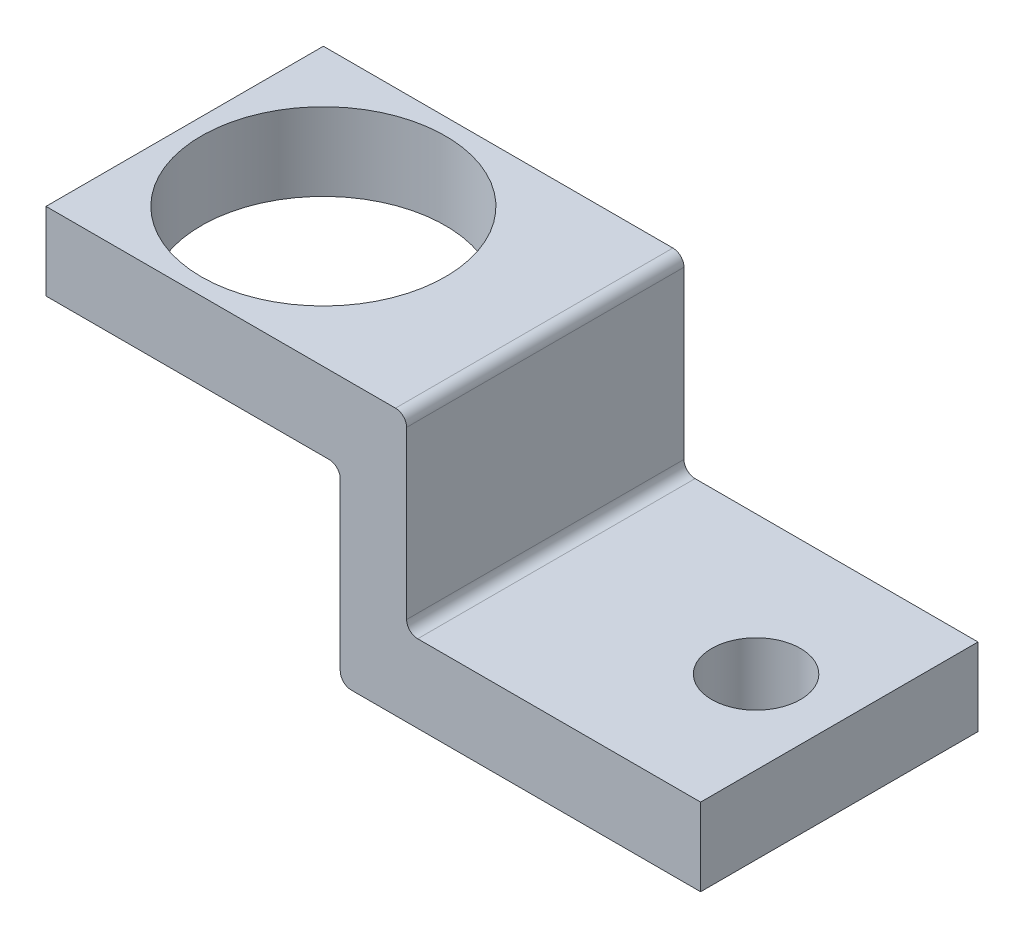
ISO-10303-21;
HEADER;
FILE_DESCRIPTION(('STEP AP214'),'2;1');
FILE_NAME('part.step','',(''),(''),'','','');
FILE_SCHEMA(('AUTOMOTIVE_DESIGN { 1 0 10303 214 1 1 1 1 }'));
ENDSEC;
DATA;
#1=APPLICATION_CONTEXT('core data for automotive mechanical design processes');
#2=APPLICATION_PROTOCOL_DEFINITION('international standard','automotive_design',2000,#1);
#3=PRODUCT_CONTEXT('',#1,'mechanical');
#4=PRODUCT('Part','Part','',(#3));
#5=PRODUCT_RELATED_PRODUCT_CATEGORY('part','',(#4));
#6=PRODUCT_DEFINITION_FORMATION('','',#4);
#7=PRODUCT_DEFINITION_CONTEXT('part definition',#1,'design');
#8=PRODUCT_DEFINITION('design','',#6,#7);
#9=PRODUCT_DEFINITION_SHAPE('','',#8);
#10=(LENGTH_UNIT() NAMED_UNIT(*) SI_UNIT(.MILLI.,.METRE.));
#11=(NAMED_UNIT(*) PLANE_ANGLE_UNIT() SI_UNIT($,.RADIAN.));
#12=(NAMED_UNIT(*) SI_UNIT($,.STERADIAN.) SOLID_ANGLE_UNIT());
#13=UNCERTAINTY_MEASURE_WITH_UNIT(LENGTH_MEASURE(1.E-05),#10,'distance_accuracy_value','');
#14=(GEOMETRIC_REPRESENTATION_CONTEXT(3) GLOBAL_UNCERTAINTY_ASSIGNED_CONTEXT((#13)) GLOBAL_UNIT_ASSIGNED_CONTEXT((#10,
#11,#12)) REPRESENTATION_CONTEXT('',''));
#15=CARTESIAN_POINT('',(0.,0.,0.));
#16=DIRECTION('',(0.,0.,1.));
#17=DIRECTION('',(1.,0.,0.));
#18=AXIS2_PLACEMENT_3D('',#15,#16,#17);
#19=CARTESIAN_POINT('',(25.5200845665962,0.,25.));
#20=DIRECTION('',(0.,1.,0.));
#21=DIRECTION('',(0.,0.,1.));
#22=AXIS2_PLACEMENT_3D('',#19,#20,#21);
#23=PLANE('',#22);
#24=CARTESIAN_POINT('',(12.5,0.,12.5));
#25=DIRECTION('',(0.,1.,0.));
#26=DIRECTION('',(0.,0.,1.));
#27=AXIS2_PLACEMENT_3D('',#24,#25,#26);
#28=CIRCLE('',#27,11.);
#29=CARTESIAN_POINT('',(12.5,0.,23.5));
#30=VERTEX_POINT('',#29);
#31=EDGE_CURVE('E173',#30,#30,#28,.T.);
#32=ORIENTED_EDGE('',*,*,#31,.T.);
#33=EDGE_LOOP('',(#32));
#34=FACE_BOUND('',#33,.T.);
#35=DIRECTION('',(1.,0.,0.));
#36=VECTOR('',#35,1.);
#37=CARTESIAN_POINT('',(25.5200845665962,0.,0.));
#38=LINE('',#37,#36);
#39=CARTESIAN_POINT('',(0.,0.,0.));
#40=VERTEX_POINT('',#39);
#41=CARTESIAN_POINT('',(25.5200845665962,0.,0.));
#42=VERTEX_POINT('',#41);
#43=EDGE_CURVE('E168',#40,#42,#38,.T.);
#44=ORIENTED_EDGE('',*,*,#43,.T.);
#45=DIRECTION('',(0.,0.,-1.));
#46=VECTOR('',#45,1.);
#47=CARTESIAN_POINT('',(25.5200845665962,0.,25.));
#48=LINE('',#47,#46);
#49=CARTESIAN_POINT('',(25.5200845665962,0.,25.));
#50=VERTEX_POINT('',#49);
#51=EDGE_CURVE('E11',#50,#42,#48,.T.);
#52=ORIENTED_EDGE('',*,*,#51,.F.);
#53=DIRECTION('',(1.,0.,0.));
#54=VECTOR('',#53,1.);
#55=CARTESIAN_POINT('',(25.5200845665962,0.,25.));
#56=LINE('',#55,#54);
#57=CARTESIAN_POINT('',(0.,0.,25.));
#58=VERTEX_POINT('',#57);
#59=EDGE_CURVE('E203',#58,#50,#56,.T.);
#60=ORIENTED_EDGE('',*,*,#59,.F.);
#61=DIRECTION('',(0.,0.,-1.));
#62=VECTOR('',#61,1.);
#63=CARTESIAN_POINT('',(0.,0.,25.));
#64=LINE('',#63,#62);
#65=EDGE_CURVE('E164',#58,#40,#64,.T.);
#66=ORIENTED_EDGE('',*,*,#65,.T.);
#67=EDGE_LOOP('',(#44,#52,#60,#66));
#68=FACE_BOUND('',#67,.T.);
#69=ADVANCED_FACE('F43',(#34,#68),#23,.F.);
#70=CARTESIAN_POINT('',(25.5200845665962,-1.,25.));
#71=DIRECTION('',(0.,0.,-1.));
#72=DIRECTION('',(-1.,0.,0.));
#73=AXIS2_PLACEMENT_3D('',#70,#71,#72);
#74=CYLINDRICAL_SURFACE('',#73,1.);
#75=CARTESIAN_POINT('',(25.5200845665962,-1.,0.));
#76=DIRECTION('',(0.,0.,-1.));
#77=DIRECTION('',(1.,0.,0.));
#78=AXIS2_PLACEMENT_3D('',#75,#76,#77);
#79=CIRCLE('',#78,1.);
#80=CARTESIAN_POINT('',(26.5200845665962,-1.00000000000001,0.));
#81=VERTEX_POINT('',#80);
#82=EDGE_CURVE('E172',#42,#81,#79,.T.);
#83=ORIENTED_EDGE('',*,*,#82,.T.);
#84=DIRECTION('',(0.,0.,-1.));
#85=VECTOR('',#84,1.);
#86=CARTESIAN_POINT('',(26.5200845665962,-1.00000000000001,25.));
#87=LINE('',#86,#85);
#88=CARTESIAN_POINT('',(26.5200845665962,-1.00000000000001,25.));
#89=VERTEX_POINT('',#88);
#90=EDGE_CURVE('E52',#89,#81,#87,.T.);
#91=ORIENTED_EDGE('',*,*,#90,.F.);
#92=CARTESIAN_POINT('',(25.5200845665962,-1.,25.));
#93=DIRECTION('',(0.,0.,-1.));
#94=DIRECTION('',(1.,0.,0.));
#95=AXIS2_PLACEMENT_3D('',#92,#93,#94);
#96=CIRCLE('',#95,1.);
#97=EDGE_CURVE('E115',#50,#89,#96,.T.);
#98=ORIENTED_EDGE('',*,*,#97,.F.);
#99=ORIENTED_EDGE('',*,*,#51,.T.);
#100=EDGE_LOOP('',(#83,#91,#98,#99));
#101=FACE_BOUND('',#100,.T.);
#102=ADVANCED_FACE('F298',(#101),#74,.F.);
#103=CARTESIAN_POINT('',(26.5200845665962,-16.,25.));
#104=DIRECTION('',(1.,0.,0.));
#105=DIRECTION('',(0.,0.,-1.));
#106=AXIS2_PLACEMENT_3D('',#103,#104,#105);
#107=PLANE('',#106);
#108=DIRECTION('',(0.,-1.,0.));
#109=VECTOR('',#108,1.);
#110=CARTESIAN_POINT('',(26.5200845665962,-16.,0.));
#111=LINE('',#110,#109);
#112=CARTESIAN_POINT('',(26.5200845665962,-16.,0.));
#113=VERTEX_POINT('',#112);
#114=EDGE_CURVE('E176',#81,#113,#111,.T.);
#115=ORIENTED_EDGE('',*,*,#114,.T.);
#116=DIRECTION('',(0.,0.,-1.));
#117=VECTOR('',#116,1.);
#118=CARTESIAN_POINT('',(26.5200845665962,-16.,25.));
#119=LINE('',#118,#117);
#120=CARTESIAN_POINT('',(26.5200845665962,-16.,25.));
#121=VERTEX_POINT('',#120);
#122=EDGE_CURVE('E230',#121,#113,#119,.T.);
#123=ORIENTED_EDGE('',*,*,#122,.F.);
#124=DIRECTION('',(0.,-1.,0.));
#125=VECTOR('',#124,1.);
#126=CARTESIAN_POINT('',(26.5200845665962,-16.,25.));
#127=LINE('',#126,#125);
#128=EDGE_CURVE('E240',#89,#121,#127,.T.);
#129=ORIENTED_EDGE('',*,*,#128,.F.);
#130=ORIENTED_EDGE('',*,*,#90,.T.);
#131=EDGE_LOOP('',(#115,#123,#129,#130));
#132=FACE_BOUND('',#131,.T.);
#133=ADVANCED_FACE('F238',(#132),#107,.F.);
#134=CARTESIAN_POINT('',(27.5200845665962,-16.,25.));
#135=DIRECTION('',(0.,0.,-1.));
#136=DIRECTION('',(-1.,0.,0.));
#137=AXIS2_PLACEMENT_3D('',#134,#135,#136);
#138=CYLINDRICAL_SURFACE('',#137,1.);
#139=CARTESIAN_POINT('',(27.5200845665962,-16.,0.));
#140=DIRECTION('',(0.,0.,1.));
#141=DIRECTION('',(-1.,0.,0.));
#142=AXIS2_PLACEMENT_3D('',#139,#140,#141);
#143=CIRCLE('',#142,1.);
#144=CARTESIAN_POINT('',(27.5200845665962,-17.,0.));
#145=VERTEX_POINT('',#144);
#146=EDGE_CURVE('E179',#113,#145,#143,.T.);
#147=ORIENTED_EDGE('',*,*,#146,.T.);
#148=DIRECTION('',(0.,0.,-1.));
#149=VECTOR('',#148,1.);
#150=CARTESIAN_POINT('',(27.5200845665962,-17.,25.));
#151=LINE('',#150,#149);
#152=CARTESIAN_POINT('',(27.5200845665962,-17.,25.));
#153=VERTEX_POINT('',#152);
#154=EDGE_CURVE('E226',#153,#145,#151,.T.);
#155=ORIENTED_EDGE('',*,*,#154,.F.);
#156=CARTESIAN_POINT('',(27.5200845665962,-16.,25.));
#157=DIRECTION('',(0.,0.,1.));
#158=DIRECTION('',(-1.,0.,0.));
#159=AXIS2_PLACEMENT_3D('',#156,#157,#158);
#160=CIRCLE('',#159,1.);
#161=EDGE_CURVE('E259',#121,#153,#160,.T.);
#162=ORIENTED_EDGE('',*,*,#161,.F.);
#163=ORIENTED_EDGE('',*,*,#122,.T.);
#164=EDGE_LOOP('',(#147,#155,#162,#163));
#165=FACE_BOUND('',#164,.T.);
#166=ADVANCED_FACE('F249',(#165),#138,.T.);
#167=CARTESIAN_POINT('',(59.0000845665962,-17.,25.));
#168=DIRECTION('',(0.,1.,0.));
#169=DIRECTION('',(-1.,0.,0.));
#170=AXIS2_PLACEMENT_3D('',#167,#168,#169);
#171=PLANE('',#170);
#172=CARTESIAN_POINT('',(51.5000845665962,-17.,12.5));
#173=DIRECTION('',(0.,1.,0.));
#174=DIRECTION('',(0.,0.,1.));
#175=AXIS2_PLACEMENT_3D('',#172,#173,#174);
#176=CIRCLE('',#175,4.);
#177=CARTESIAN_POINT('',(51.5000845665962,-17.,16.5));
#178=VERTEX_POINT('',#177);
#179=EDGE_CURVE('E311',#178,#178,#176,.T.);
#180=ORIENTED_EDGE('',*,*,#179,.T.);
#181=EDGE_LOOP('',(#180));
#182=FACE_BOUND('',#181,.T.);
#183=DIRECTION('',(1.,0.,0.));
#184=VECTOR('',#183,1.);
#185=CARTESIAN_POINT('',(59.0000845665962,-17.,0.));
#186=LINE('',#185,#184);
#187=CARTESIAN_POINT('',(59.0000845665962,-17.,0.));
#188=VERTEX_POINT('',#187);
#189=EDGE_CURVE('E182',#145,#188,#186,.T.);
#190=ORIENTED_EDGE('',*,*,#189,.T.);
#191=DIRECTION('',(0.,0.,-1.));
#192=VECTOR('',#191,1.);
#193=CARTESIAN_POINT('',(59.0000845665962,-17.,25.));
#194=LINE('',#193,#192);
#195=CARTESIAN_POINT('',(59.0000845665962,-17.,25.));
#196=VERTEX_POINT('',#195);
#197=EDGE_CURVE('E222',#196,#188,#194,.T.);
#198=ORIENTED_EDGE('',*,*,#197,.F.);
#199=DIRECTION('',(1.,0.,0.));
#200=VECTOR('',#199,1.);
#201=CARTESIAN_POINT('',(59.0000845665962,-17.,25.));
#202=LINE('',#201,#200);
#203=EDGE_CURVE('E255',#153,#196,#202,.T.);
#204=ORIENTED_EDGE('',*,*,#203,.F.);
#205=ORIENTED_EDGE('',*,*,#154,.T.);
#206=EDGE_LOOP('',(#190,#198,#204,#205));
#207=FACE_BOUND('',#206,.T.);
#208=ADVANCED_FACE('F253',(#182,#207),#171,.F.);
#209=CARTESIAN_POINT('',(59.0000845665962,-10.,25.));
#210=DIRECTION('',(-1.,0.,0.));
#211=DIRECTION('',(0.,0.,1.));
#212=AXIS2_PLACEMENT_3D('',#209,#210,#211);
#213=PLANE('',#212);
#214=DIRECTION('',(0.,1.,0.));
#215=VECTOR('',#214,1.);
#216=CARTESIAN_POINT('',(59.0000845665962,-10.,0.));
#217=LINE('',#216,#215);
#218=CARTESIAN_POINT('',(59.0000845665962,-10.,0.));
#219=VERTEX_POINT('',#218);
#220=EDGE_CURVE('E185',#188,#219,#217,.T.);
#221=ORIENTED_EDGE('',*,*,#220,.T.);
#222=DIRECTION('',(0.,0.,-1.));
#223=VECTOR('',#222,1.);
#224=CARTESIAN_POINT('',(59.0000845665962,-10.,25.));
#225=LINE('',#224,#223);
#226=CARTESIAN_POINT('',(59.0000845665962,-10.,25.));
#227=VERTEX_POINT('',#226);
#228=EDGE_CURVE('E218',#227,#219,#225,.T.);
#229=ORIENTED_EDGE('',*,*,#228,.F.);
#230=DIRECTION('',(0.,1.,0.));
#231=VECTOR('',#230,1.);
#232=CARTESIAN_POINT('',(59.0000845665962,-10.,25.));
#233=LINE('',#232,#231);
#234=EDGE_CURVE('E258',#196,#227,#233,.T.);
#235=ORIENTED_EDGE('',*,*,#234,.F.);
#236=ORIENTED_EDGE('',*,*,#197,.T.);
#237=EDGE_LOOP('',(#221,#229,#235,#236));
#238=FACE_BOUND('',#237,.T.);
#239=ADVANCED_FACE('F338',(#238),#213,.F.);
#240=CARTESIAN_POINT('',(33.5,-10.,25.));
#241=DIRECTION('',(0.,-1.,0.));
#242=DIRECTION('',(0.,0.,-1.));
#243=AXIS2_PLACEMENT_3D('',#240,#241,#242);
#244=PLANE('',#243);
#245=CARTESIAN_POINT('',(51.5000845665962,-10.,12.5));
#246=DIRECTION('',(0.,1.,0.));
#247=DIRECTION('',(0.,0.,1.));
#248=AXIS2_PLACEMENT_3D('',#245,#246,#247);
#249=CIRCLE('',#248,4.);
#250=CARTESIAN_POINT('',(51.5000845665962,-10.,16.5));
#251=VERTEX_POINT('',#250);
#252=EDGE_CURVE('E319',#251,#251,#249,.T.);
#253=ORIENTED_EDGE('',*,*,#252,.F.);
#254=EDGE_LOOP('',(#253));
#255=FACE_BOUND('',#254,.T.);
#256=DIRECTION('',(-1.,0.,0.));
#257=VECTOR('',#256,1.);
#258=CARTESIAN_POINT('',(33.5,-10.,0.));
#259=LINE('',#258,#257);
#260=CARTESIAN_POINT('',(33.5,-10.,0.));
#261=VERTEX_POINT('',#260);
#262=EDGE_CURVE('E188',#219,#261,#259,.T.);
#263=ORIENTED_EDGE('',*,*,#262,.T.);
#264=DIRECTION('',(0.,0.,-1.));
#265=VECTOR('',#264,1.);
#266=CARTESIAN_POINT('',(33.5,-10.,25.));
#267=LINE('',#266,#265);
#268=CARTESIAN_POINT('',(33.5,-10.,25.));
#269=VERTEX_POINT('',#268);
#270=EDGE_CURVE('E214',#269,#261,#267,.T.);
#271=ORIENTED_EDGE('',*,*,#270,.F.);
#272=DIRECTION('',(-1.,0.,0.));
#273=VECTOR('',#272,1.);
#274=CARTESIAN_POINT('',(33.5,-10.,25.));
#275=LINE('',#274,#273);
#276=EDGE_CURVE('E263',#227,#269,#275,.T.);
#277=ORIENTED_EDGE('',*,*,#276,.F.);
#278=ORIENTED_EDGE('',*,*,#228,.T.);
#279=EDGE_LOOP('',(#263,#271,#277,#278));
#280=FACE_BOUND('',#279,.T.);
#281=ADVANCED_FACE('F335',(#255,#280),#244,.F.);
#282=CARTESIAN_POINT('',(33.5,-9.,25.));
#283=DIRECTION('',(0.,0.,-1.));
#284=DIRECTION('',(-1.,0.,0.));
#285=AXIS2_PLACEMENT_3D('',#282,#283,#284);
#286=CYLINDRICAL_SURFACE('',#285,1.);
#287=CARTESIAN_POINT('',(33.5,-9.,0.));
#288=DIRECTION('',(0.,0.,-1.));
#289=DIRECTION('',(-1.,0.,0.));
#290=AXIS2_PLACEMENT_3D('',#287,#288,#289);
#291=CIRCLE('',#290,1.);
#292=CARTESIAN_POINT('',(32.5,-9.,0.));
#293=VERTEX_POINT('',#292);
#294=EDGE_CURVE('E191',#261,#293,#291,.T.);
#295=ORIENTED_EDGE('',*,*,#294,.T.);
#296=DIRECTION('',(0.,0.,-1.));
#297=VECTOR('',#296,1.);
#298=CARTESIAN_POINT('',(32.5,-9.,25.));
#299=LINE('',#298,#297);
#300=CARTESIAN_POINT('',(32.5,-9.,25.));
#301=VERTEX_POINT('',#300);
#302=EDGE_CURVE('E210',#301,#293,#299,.T.);
#303=ORIENTED_EDGE('',*,*,#302,.F.);
#304=CARTESIAN_POINT('',(33.5,-9.,25.));
#305=DIRECTION('',(0.,0.,-1.));
#306=DIRECTION('',(-1.,0.,0.));
#307=AXIS2_PLACEMENT_3D('',#304,#305,#306);
#308=CIRCLE('',#307,1.);
#309=EDGE_CURVE('E270',#269,#301,#308,.T.);
#310=ORIENTED_EDGE('',*,*,#309,.F.);
#311=ORIENTED_EDGE('',*,*,#270,.T.);
#312=EDGE_LOOP('',(#295,#303,#310,#311));
#313=FACE_BOUND('',#312,.T.);
#314=ADVANCED_FACE('F278',(#313),#286,.F.);
#315=CARTESIAN_POINT('',(32.5,5.99999999999999,25.));
#316=DIRECTION('',(-1.,0.,0.));
#317=DIRECTION('',(0.,-1.,0.));
#318=AXIS2_PLACEMENT_3D('',#315,#316,#317);
#319=PLANE('',#318);
#320=DIRECTION('',(0.,1.,0.));
#321=VECTOR('',#320,1.);
#322=CARTESIAN_POINT('',(32.5,5.99999999999999,0.));
#323=LINE('',#322,#321);
#324=CARTESIAN_POINT('',(32.5,5.99999999999999,0.));
#325=VERTEX_POINT('',#324);
#326=EDGE_CURVE('E194',#293,#325,#323,.T.);
#327=ORIENTED_EDGE('',*,*,#326,.T.);
#328=DIRECTION('',(0.,0.,-1.));
#329=VECTOR('',#328,1.);
#330=CARTESIAN_POINT('',(32.5,5.99999999999999,25.));
#331=LINE('',#330,#329);
#332=CARTESIAN_POINT('',(32.5,5.99999999999999,25.));
#333=VERTEX_POINT('',#332);
#334=EDGE_CURVE('E157',#333,#325,#331,.T.);
#335=ORIENTED_EDGE('',*,*,#334,.F.);
#336=DIRECTION('',(0.,1.,0.));
#337=VECTOR('',#336,1.);
#338=CARTESIAN_POINT('',(32.5,5.99999999999999,25.));
#339=LINE('',#338,#337);
#340=EDGE_CURVE('E146',#301,#333,#339,.T.);
#341=ORIENTED_EDGE('',*,*,#340,.F.);
#342=ORIENTED_EDGE('',*,*,#302,.T.);
#343=EDGE_LOOP('',(#327,#335,#341,#342));
#344=FACE_BOUND('',#343,.T.);
#345=ADVANCED_FACE('F282',(#344),#319,.F.);
#346=CARTESIAN_POINT('',(31.5,6.,25.));
#347=DIRECTION('',(0.,0.,-1.));
#348=DIRECTION('',(-1.,0.,0.));
#349=AXIS2_PLACEMENT_3D('',#346,#347,#348);
#350=CYLINDRICAL_SURFACE('',#349,1.);
#351=CARTESIAN_POINT('',(31.5,6.,0.));
#352=DIRECTION('',(0.,0.,1.));
#353=DIRECTION('',(1.,0.,0.));
#354=AXIS2_PLACEMENT_3D('',#351,#352,#353);
#355=CIRCLE('',#354,1.);
#356=CARTESIAN_POINT('',(31.5,7.,0.));
#357=VERTEX_POINT('',#356);
#358=EDGE_CURVE('E155',#325,#357,#355,.T.);
#359=ORIENTED_EDGE('',*,*,#358,.T.);
#360=DIRECTION('',(0.,0.,-1.));
#361=VECTOR('',#360,1.);
#362=CARTESIAN_POINT('',(31.5,7.,25.));
#363=LINE('',#362,#361);
#364=CARTESIAN_POINT('',(31.5,7.,25.));
#365=VERTEX_POINT('',#364);
#366=EDGE_CURVE('E152',#365,#357,#363,.T.);
#367=ORIENTED_EDGE('',*,*,#366,.F.);
#368=CARTESIAN_POINT('',(31.5,6.,25.));
#369=DIRECTION('',(0.,0.,1.));
#370=DIRECTION('',(1.,0.,0.));
#371=AXIS2_PLACEMENT_3D('',#368,#369,#370);
#372=CIRCLE('',#371,1.);
#373=EDGE_CURVE('E140',#333,#365,#372,.T.);
#374=ORIENTED_EDGE('',*,*,#373,.F.);
#375=ORIENTED_EDGE('',*,*,#334,.T.);
#376=EDGE_LOOP('',(#359,#367,#374,#375));
#377=FACE_BOUND('',#376,.T.);
#378=ADVANCED_FACE('F153',(#377),#350,.T.);
#379=CARTESIAN_POINT('',(0.,7.,25.));
#380=DIRECTION('',(0.,-1.,0.));
#381=DIRECTION('',(0.,0.,-1.));
#382=AXIS2_PLACEMENT_3D('',#379,#380,#381);
#383=PLANE('',#382);
#384=CARTESIAN_POINT('',(12.5,7.,12.5));
#385=DIRECTION('',(0.,1.,0.));
#386=DIRECTION('',(0.,0.,1.));
#387=AXIS2_PLACEMENT_3D('',#384,#385,#386);
#388=CIRCLE('',#387,11.);
#389=CARTESIAN_POINT('',(12.5,7.,23.5));
#390=VERTEX_POINT('',#389);
#391=EDGE_CURVE('E307',#390,#390,#388,.T.);
#392=ORIENTED_EDGE('',*,*,#391,.F.);
#393=EDGE_LOOP('',(#392));
#394=FACE_BOUND('',#393,.T.);
#395=DIRECTION('',(-1.,0.,0.));
#396=VECTOR('',#395,1.);
#397=CARTESIAN_POINT('',(0.,7.,0.));
#398=LINE('',#397,#396);
#399=CARTESIAN_POINT('',(0.,7.,0.));
#400=VERTEX_POINT('',#399);
#401=EDGE_CURVE('E101',#357,#400,#398,.T.);
#402=ORIENTED_EDGE('',*,*,#401,.T.);
#403=DIRECTION('',(0.,0.,-1.));
#404=VECTOR('',#403,1.);
#405=CARTESIAN_POINT('',(0.,7.,25.));
#406=LINE('',#405,#404);
#407=CARTESIAN_POINT('',(0.,7.,25.));
#408=VERTEX_POINT('',#407);
#409=EDGE_CURVE('E158',#408,#400,#406,.T.);
#410=ORIENTED_EDGE('',*,*,#409,.F.);
#411=DIRECTION('',(-1.,0.,0.));
#412=VECTOR('',#411,1.);
#413=CARTESIAN_POINT('',(0.,7.,25.));
#414=LINE('',#413,#412);
#415=EDGE_CURVE('E144',#365,#408,#414,.T.);
#416=ORIENTED_EDGE('',*,*,#415,.F.);
#417=ORIENTED_EDGE('',*,*,#366,.T.);
#418=EDGE_LOOP('',(#402,#410,#416,#417));
#419=FACE_BOUND('',#418,.T.);
#420=ADVANCED_FACE('F160',(#394,#419),#383,.F.);
#421=CARTESIAN_POINT('',(0.,0.,25.));
#422=DIRECTION('',(1.,0.,0.));
#423=DIRECTION('',(0.,0.,-1.));
#424=AXIS2_PLACEMENT_3D('',#421,#422,#423);
#425=PLANE('',#424);
#426=DIRECTION('',(0.,-1.,0.));
#427=VECTOR('',#426,1.);
#428=CARTESIAN_POINT('',(0.,0.,0.));
#429=LINE('',#428,#427);
#430=EDGE_CURVE('E107',#400,#40,#429,.T.);
#431=ORIENTED_EDGE('',*,*,#430,.T.);
#432=ORIENTED_EDGE('',*,*,#65,.F.);
#433=DIRECTION('',(0.,-1.,0.));
#434=VECTOR('',#433,1.);
#435=CARTESIAN_POINT('',(0.,0.,25.));
#436=LINE('',#435,#434);
#437=EDGE_CURVE('E60',#408,#58,#436,.T.);
#438=ORIENTED_EDGE('',*,*,#437,.F.);
#439=ORIENTED_EDGE('',*,*,#409,.T.);
#440=EDGE_LOOP('',(#431,#432,#438,#439));
#441=FACE_BOUND('',#440,.T.);
#442=ADVANCED_FACE('F286',(#441),#425,.F.);
#443=CARTESIAN_POINT('',(31.5,6.,25.));
#444=DIRECTION('',(0.,0.,1.));
#445=DIRECTION('',(1.,0.,0.));
#446=AXIS2_PLACEMENT_3D('',#443,#444,#445);
#447=PLANE('',#446);
#448=ORIENTED_EDGE('',*,*,#59,.T.);
#449=ORIENTED_EDGE('',*,*,#97,.T.);
#450=ORIENTED_EDGE('',*,*,#128,.T.);
#451=ORIENTED_EDGE('',*,*,#161,.T.);
#452=ORIENTED_EDGE('',*,*,#203,.T.);
#453=ORIENTED_EDGE('',*,*,#234,.T.);
#454=ORIENTED_EDGE('',*,*,#276,.T.);
#455=ORIENTED_EDGE('',*,*,#309,.T.);
#456=ORIENTED_EDGE('',*,*,#340,.T.);
#457=ORIENTED_EDGE('',*,*,#373,.T.);
#458=ORIENTED_EDGE('',*,*,#415,.T.);
#459=ORIENTED_EDGE('',*,*,#437,.T.);
#460=EDGE_LOOP('',(#448,#449,#450,#451,#452,#453,#454,#455,#456,#457,#458,#459));
#461=FACE_BOUND('',#460,.T.);
#462=ADVANCED_FACE('F142',(#461),#447,.T.);
#463=CARTESIAN_POINT('',(31.5,6.,0.));
#464=DIRECTION('',(0.,0.,1.));
#465=DIRECTION('',(1.,0.,0.));
#466=AXIS2_PLACEMENT_3D('',#463,#464,#465);
#467=PLANE('',#466);
#468=ORIENTED_EDGE('',*,*,#43,.F.);
#469=ORIENTED_EDGE('',*,*,#430,.F.);
#470=ORIENTED_EDGE('',*,*,#401,.F.);
#471=ORIENTED_EDGE('',*,*,#358,.F.);
#472=ORIENTED_EDGE('',*,*,#326,.F.);
#473=ORIENTED_EDGE('',*,*,#294,.F.);
#474=ORIENTED_EDGE('',*,*,#262,.F.);
#475=ORIENTED_EDGE('',*,*,#220,.F.);
#476=ORIENTED_EDGE('',*,*,#189,.F.);
#477=ORIENTED_EDGE('',*,*,#146,.F.);
#478=ORIENTED_EDGE('',*,*,#114,.F.);
#479=ORIENTED_EDGE('',*,*,#82,.F.);
#480=EDGE_LOOP('',(#468,#469,#470,#471,#472,#473,#474,#475,#476,#477,#478,#479));
#481=FACE_BOUND('',#480,.T.);
#482=ADVANCED_FACE('F244',(#481),#467,.F.);
#483=CARTESIAN_POINT('',(12.5,-17.,12.5));
#484=DIRECTION('',(0.,1.,0.));
#485=DIRECTION('',(0.,0.,1.));
#486=AXIS2_PLACEMENT_3D('',#483,#484,#485);
#487=CYLINDRICAL_SURFACE('',#486,11.);
#488=ORIENTED_EDGE('',*,*,#391,.T.);
#489=EDGE_LOOP('',(#488));
#490=FACE_BOUND('',#489,.T.);
#491=ORIENTED_EDGE('',*,*,#31,.F.);
#492=EDGE_LOOP('',(#491));
#493=FACE_BOUND('',#492,.T.);
#494=ADVANCED_FACE('F331',(#490,#493),#487,.F.);
#495=CARTESIAN_POINT('',(51.5000845665962,-17.,12.5));
#496=DIRECTION('',(0.,1.,0.));
#497=DIRECTION('',(0.,0.,1.));
#498=AXIS2_PLACEMENT_3D('',#495,#496,#497);
#499=CYLINDRICAL_SURFACE('',#498,4.);
#500=CARTESIAN_POINT('',(51.5000845665962,-17.,16.5));
#501=CARTESIAN_POINT('',(51.5000845665962,-16.9270833333333,16.5));
#502=CARTESIAN_POINT('',(51.5000845665962,-16.8541666666667,16.5));
#503=CARTESIAN_POINT('',(51.5000845665962,-16.7083333333333,16.5));
#504=CARTESIAN_POINT('',(51.5000845665962,-16.6354166666667,16.5));
#505=CARTESIAN_POINT('',(51.5000845665962,-16.4895833333333,16.5));
#506=CARTESIAN_POINT('',(51.5000845665962,-16.4166666666667,16.5));
#507=CARTESIAN_POINT('',(51.5000845665962,-16.2708333333333,16.5));
#508=CARTESIAN_POINT('',(51.5000845665962,-16.1979166666667,16.5));
#509=CARTESIAN_POINT('',(51.5000845665962,-16.0520833333333,16.5));
#510=CARTESIAN_POINT('',(51.5000845665962,-15.9791666666667,16.5));
#511=CARTESIAN_POINT('',(51.5000845665962,-15.8333333333333,16.5));
#512=CARTESIAN_POINT('',(51.5000845665962,-15.7604166666667,16.5));
#513=CARTESIAN_POINT('',(51.5000845665962,-15.6145833333333,16.5));
#514=CARTESIAN_POINT('',(51.5000845665962,-15.5416666666667,16.5));
#515=CARTESIAN_POINT('',(51.5000845665962,-15.3958333333333,16.5));
#516=CARTESIAN_POINT('',(51.5000845665962,-15.3229166666667,16.5));
#517=CARTESIAN_POINT('',(51.5000845665962,-15.1770833333333,16.5));
#518=CARTESIAN_POINT('',(51.5000845665962,-15.1041666666667,16.5));
#519=CARTESIAN_POINT('',(51.5000845665962,-14.9583333333333,16.5));
#520=CARTESIAN_POINT('',(51.5000845665962,-14.8854166666667,16.5));
#521=CARTESIAN_POINT('',(51.5000845665962,-14.7395833333333,16.5));
#522=CARTESIAN_POINT('',(51.5000845665962,-14.6666666666667,16.5));
#523=CARTESIAN_POINT('',(51.5000845665962,-14.5208333333333,16.5));
#524=CARTESIAN_POINT('',(51.5000845665962,-14.4479166666667,16.5));
#525=CARTESIAN_POINT('',(51.5000845665962,-14.3020833333333,16.5));
#526=CARTESIAN_POINT('',(51.5000845665962,-14.2291666666667,16.5));
#527=CARTESIAN_POINT('',(51.5000845665962,-14.0833333333333,16.5));
#528=CARTESIAN_POINT('',(51.5000845665962,-14.0104166666667,16.5));
#529=CARTESIAN_POINT('',(51.5000845665962,-13.8645833333333,16.5));
#530=CARTESIAN_POINT('',(51.5000845665962,-13.7916666666667,16.5));
#531=CARTESIAN_POINT('',(51.5000845665962,-13.6458333333333,16.5));
#532=CARTESIAN_POINT('',(51.5000845665962,-13.5729166666667,16.5));
#533=CARTESIAN_POINT('',(51.5000845665962,-13.4270833333333,16.5));
#534=CARTESIAN_POINT('',(51.5000845665962,-13.3541666666667,16.5));
#535=CARTESIAN_POINT('',(51.5000845665962,-13.2083333333333,16.5));
#536=CARTESIAN_POINT('',(51.5000845665962,-13.1354166666667,16.5));
#537=CARTESIAN_POINT('',(51.5000845665962,-12.9895833333333,16.5));
#538=CARTESIAN_POINT('',(51.5000845665962,-12.9166666666667,16.5));
#539=CARTESIAN_POINT('',(51.5000845665962,-12.7708333333333,16.5));
#540=CARTESIAN_POINT('',(51.5000845665962,-12.6979166666667,16.5));
#541=CARTESIAN_POINT('',(51.5000845665962,-12.5520833333333,16.5));
#542=CARTESIAN_POINT('',(51.5000845665962,-12.4791666666667,16.5));
#543=CARTESIAN_POINT('',(51.5000845665962,-12.3333333333333,16.5));
#544=CARTESIAN_POINT('',(51.5000845665962,-12.2604166666667,16.5));
#545=CARTESIAN_POINT('',(51.5000845665962,-12.1145833333333,16.5));
#546=CARTESIAN_POINT('',(51.5000845665962,-12.0416666666667,16.5));
#547=CARTESIAN_POINT('',(51.5000845665962,-11.8958333333333,16.5));
#548=CARTESIAN_POINT('',(51.5000845665962,-11.8229166666667,16.5));
#549=CARTESIAN_POINT('',(51.5000845665962,-11.6770833333333,16.5));
#550=CARTESIAN_POINT('',(51.5000845665962,-11.6041666666667,16.5));
#551=CARTESIAN_POINT('',(51.5000845665962,-11.4583333333333,16.5));
#552=CARTESIAN_POINT('',(51.5000845665962,-11.3854166666667,16.5));
#553=CARTESIAN_POINT('',(51.5000845665962,-11.2395833333333,16.5));
#554=CARTESIAN_POINT('',(51.5000845665962,-11.1666666666667,16.5));
#555=CARTESIAN_POINT('',(51.5000845665962,-11.0208333333333,16.5));
#556=CARTESIAN_POINT('',(51.5000845665962,-10.9479166666667,16.5));
#557=CARTESIAN_POINT('',(51.5000845665962,-10.8020833333333,16.5));
#558=CARTESIAN_POINT('',(51.5000845665962,-10.7291666666667,16.5));
#559=CARTESIAN_POINT('',(51.5000845665962,-10.5833333333333,16.5));
#560=CARTESIAN_POINT('',(51.5000845665962,-10.5104166666667,16.5));
#561=CARTESIAN_POINT('',(51.5000845665962,-10.3645833333333,16.5));
#562=CARTESIAN_POINT('',(51.5000845665962,-10.2916666666667,16.5));
#563=CARTESIAN_POINT('',(51.5000845665962,-10.1458333333333,16.5));
#564=CARTESIAN_POINT('',(51.5000845665962,-10.0729166666667,16.5));
#565=CARTESIAN_POINT('',(51.5000845665962,-10.,16.5));
#566=B_SPLINE_CURVE_WITH_KNOTS('',3,(#500,#501,#502,#503,#504,#505,#506,#507,#508,#509,#510,
#511,#512,#513,#514,#515,#516,#517,#518,#519,#520,#521,#522,#523,#524,#525,#526,#527,#528,#529,
#530,#531,#532,#533,#534,#535,#536,#537,#538,#539,#540,#541,#542,#543,#544,#545,#546,#547,#548,
#549,#550,#551,#552,#553,#554,#555,#556,#557,#558,#559,#560,#561,#562,#563,#564,#565),
.UNSPECIFIED.,.F.,.F.,(4,2,2,2,2,2,2,2,2,2,2,2,2,2,2,2,2,2,2,2,2,2,2,2,2,2,2,2,2,2,2,2,4),(0.,
0.218749999999997,0.437499999999997,0.656249999999997,0.874999999999997,1.09375,1.3125,1.53125,
1.75,1.96875,2.1875,2.40625,2.625,2.84375,3.0625,3.28125,3.5,3.71875,3.9375,4.15625,4.375,
4.59375,4.8125,5.03125,5.25,5.46875,5.6875,5.90625,6.125,6.34375,6.5625,6.78125,7.),.UNSPECIFIED.);
#567=EDGE_CURVE('BSEAM328',#178,#251,#566,.T.);
#568=ORIENTED_EDGE('',*,*,#179,.F.);
#569=ORIENTED_EDGE('',*,*,#252,.T.);
#570=ORIENTED_EDGE('',*,*,#567,.T.);
#571=ORIENTED_EDGE('',*,*,#567,.F.);
#572=EDGE_LOOP('',(#568,#570,#569,#571));
#573=FACE_BOUND('',#572,.T.);
#574=ADVANCED_FACE('F328',(#573),#499,.F.);
#575=CLOSED_SHELL('',(#69,#102,#133,#166,#208,#239,#281,#314,#345,#378,#420,#442,#462,#482,#494,#574));
#576=MANIFOLD_SOLID_BREP('B2',#575);
#577=ADVANCED_BREP_SHAPE_REPRESENTATION('',(#18,#576),#14);
#578=SHAPE_DEFINITION_REPRESENTATION(#9,#577);
ENDSEC;
END-ISO-10303-21;
